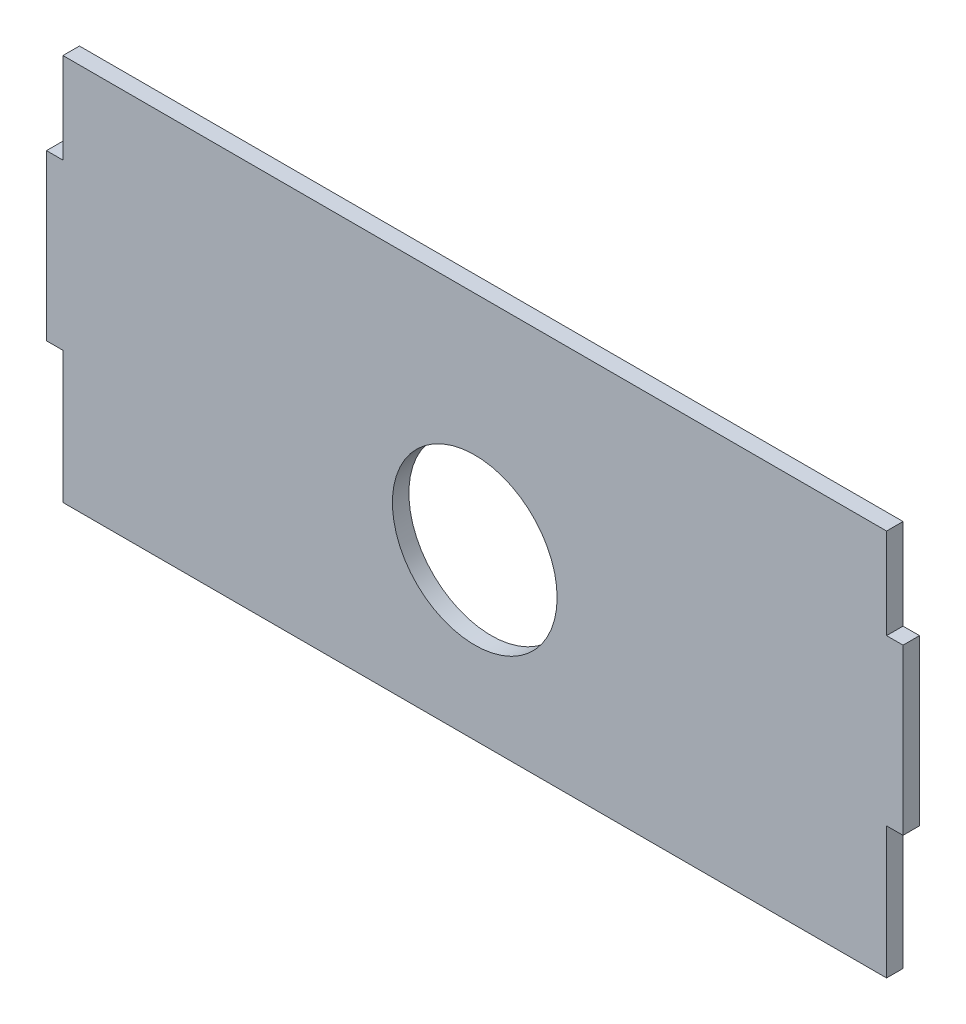
ISO-10303-21;
HEADER;
FILE_DESCRIPTION(('STEP AP214'),'2;1');
FILE_NAME('part.step','',(''),(''),'','','');
FILE_SCHEMA(('AUTOMOTIVE_DESIGN { 1 0 10303 214 1 1 1 1 }'));
ENDSEC;
DATA;
#1=APPLICATION_CONTEXT('core data for automotive mechanical design processes');
#2=APPLICATION_PROTOCOL_DEFINITION('international standard','automotive_design',2000,#1);
#3=PRODUCT_CONTEXT('',#1,'mechanical');
#4=PRODUCT('Part','Part','',(#3));
#5=PRODUCT_RELATED_PRODUCT_CATEGORY('part','',(#4));
#6=PRODUCT_DEFINITION_FORMATION('','',#4);
#7=PRODUCT_DEFINITION_CONTEXT('part definition',#1,'design');
#8=PRODUCT_DEFINITION('design','',#6,#7);
#9=PRODUCT_DEFINITION_SHAPE('','',#8);
#10=(LENGTH_UNIT() NAMED_UNIT(*) SI_UNIT(.MILLI.,.METRE.));
#11=(NAMED_UNIT(*) PLANE_ANGLE_UNIT() SI_UNIT($,.RADIAN.));
#12=(NAMED_UNIT(*) SI_UNIT($,.STERADIAN.) SOLID_ANGLE_UNIT());
#13=UNCERTAINTY_MEASURE_WITH_UNIT(LENGTH_MEASURE(1.E-05),#10,'distance_accuracy_value','');
#14=(GEOMETRIC_REPRESENTATION_CONTEXT(3) GLOBAL_UNCERTAINTY_ASSIGNED_CONTEXT((#13)) GLOBAL_UNIT_ASSIGNED_CONTEXT((#10,
#11,#12)) REPRESENTATION_CONTEXT('',''));
#15=CARTESIAN_POINT('',(0.,0.,0.));
#16=DIRECTION('',(0.,0.,1.));
#17=DIRECTION('',(1.,0.,0.));
#18=AXIS2_PLACEMENT_3D('',#15,#16,#17);
#19=CARTESIAN_POINT('',(50.,20.,2.));
#20=DIRECTION('',(0.,0.,-1.));
#21=DIRECTION('',(-1.,0.,0.));
#22=AXIS2_PLACEMENT_3D('',#19,#20,#21);
#23=CYLINDRICAL_SURFACE('',#22,10.);
#24=CARTESIAN_POINT('',(50.,20.,2.));
#25=DIRECTION('',(0.,0.,1.));
#26=DIRECTION('',(1.,0.,0.));
#27=AXIS2_PLACEMENT_3D('',#24,#25,#26);
#28=CIRCLE('',#27,10.);
#29=CARTESIAN_POINT('',(60.,20.,2.));
#30=VERTEX_POINT('',#29);
#31=EDGE_CURVE('E189',#30,#30,#28,.T.);
#32=ORIENTED_EDGE('',*,*,#31,.T.);
#33=EDGE_LOOP('',(#32));
#34=FACE_BOUND('',#33,.T.);
#35=CARTESIAN_POINT('',(50.,20.,0.));
#36=DIRECTION('',(0.,0.,1.));
#37=DIRECTION('',(1.,0.,0.));
#38=AXIS2_PLACEMENT_3D('',#35,#36,#37);
#39=CIRCLE('',#38,10.);
#40=CARTESIAN_POINT('',(60.,20.,0.));
#41=VERTEX_POINT('',#40);
#42=EDGE_CURVE('E181',#41,#41,#39,.T.);
#43=ORIENTED_EDGE('',*,*,#42,.F.);
#44=EDGE_LOOP('',(#43));
#45=FACE_BOUND('',#44,.T.);
#46=ADVANCED_FACE('F71',(#34,#45),#23,.F.);
#47=CARTESIAN_POINT('',(3.33066907387588E-13,16.0000000000021,2.));
#48=DIRECTION('',(0.,1.,0.));
#49=DIRECTION('',(-1.,0.,0.));
#50=AXIS2_PLACEMENT_3D('',#47,#48,#49);
#51=PLANE('',#50);
#52=DIRECTION('',(1.,0.,0.));
#53=VECTOR('',#52,1.);
#54=CARTESIAN_POINT('',(3.33066907387588E-13,16.0000000000021,0.));
#55=LINE('',#54,#53);
#56=CARTESIAN_POINT('',(100.,16.,0.));
#57=VERTEX_POINT('',#56);
#58=CARTESIAN_POINT('',(102.,16.,0.));
#59=VERTEX_POINT('',#58);
#60=EDGE_CURVE('E178',#57,#59,#55,.T.);
#61=ORIENTED_EDGE('',*,*,#60,.T.);
#62=DIRECTION('',(0.,0.,-1.));
#63=VECTOR('',#62,1.);
#64=CARTESIAN_POINT('',(102.,16.,2.));
#65=LINE('',#64,#63);
#66=CARTESIAN_POINT('',(102.,16.,2.));
#67=VERTEX_POINT('',#66);
#68=EDGE_CURVE('E185',#67,#59,#65,.T.);
#69=ORIENTED_EDGE('',*,*,#68,.F.);
#70=DIRECTION('',(1.,0.,0.));
#71=VECTOR('',#70,1.);
#72=CARTESIAN_POINT('',(3.33066907387588E-13,16.0000000000021,2.));
#73=LINE('',#72,#71);
#74=CARTESIAN_POINT('',(100.,16.,2.));
#75=VERTEX_POINT('',#74);
#76=EDGE_CURVE('E237',#75,#67,#73,.T.);
#77=ORIENTED_EDGE('',*,*,#76,.F.);
#78=DIRECTION('',(0.,0.,-1.));
#79=VECTOR('',#78,1.);
#80=CARTESIAN_POINT('',(100.,16.,2.));
#81=LINE('',#80,#79);
#82=EDGE_CURVE('E188',#75,#57,#81,.T.);
#83=ORIENTED_EDGE('',*,*,#82,.T.);
#84=EDGE_LOOP('',(#61,#69,#77,#83));
#85=FACE_BOUND('',#84,.T.);
#86=ADVANCED_FACE('F234',(#85),#51,.F.);
#87=CARTESIAN_POINT('',(100.,0.,2.));
#88=DIRECTION('',(-1.,0.,0.));
#89=DIRECTION('',(0.,0.,1.));
#90=AXIS2_PLACEMENT_3D('',#87,#88,#89);
#91=PLANE('',#90);
#92=DIRECTION('',(0.,1.,0.));
#93=VECTOR('',#92,1.);
#94=CARTESIAN_POINT('',(100.,0.,0.));
#95=LINE('',#94,#93);
#96=CARTESIAN_POINT('',(100.,0.,0.));
#97=VERTEX_POINT('',#96);
#98=EDGE_CURVE('E177',#97,#57,#95,.T.);
#99=ORIENTED_EDGE('',*,*,#98,.T.);
#100=ORIENTED_EDGE('',*,*,#82,.F.);
#101=DIRECTION('',(0.,1.,0.));
#102=VECTOR('',#101,1.);
#103=CARTESIAN_POINT('',(100.,0.,2.));
#104=LINE('',#103,#102);
#105=CARTESIAN_POINT('',(100.,0.,2.));
#106=VERTEX_POINT('',#105);
#107=EDGE_CURVE('E246',#106,#75,#104,.T.);
#108=ORIENTED_EDGE('',*,*,#107,.F.);
#109=DIRECTION('',(0.,0.,-1.));
#110=VECTOR('',#109,1.);
#111=CARTESIAN_POINT('',(100.,0.,2.));
#112=LINE('',#111,#110);
#113=EDGE_CURVE('E192',#106,#97,#112,.T.);
#114=ORIENTED_EDGE('',*,*,#113,.T.);
#115=EDGE_LOOP('',(#99,#100,#108,#114));
#116=FACE_BOUND('',#115,.T.);
#117=ADVANCED_FACE('F224',(#116),#91,.F.);
#118=CARTESIAN_POINT('',(100.,36.,0.));
#119=VERTEX_POINT('',#118);
#120=CARTESIAN_POINT('',(100.,47.,0.));
#121=VERTEX_POINT('',#120);
#122=EDGE_CURVE('E171',#119,#121,#95,.T.);
#123=ORIENTED_EDGE('',*,*,#122,.T.);
#124=DIRECTION('',(0.,0.,-1.));
#125=VECTOR('',#124,1.);
#126=CARTESIAN_POINT('',(100.,47.,2.));
#127=LINE('',#126,#125);
#128=CARTESIAN_POINT('',(100.,47.,2.));
#129=VERTEX_POINT('',#128);
#130=EDGE_CURVE('E153',#129,#121,#127,.T.);
#131=ORIENTED_EDGE('',*,*,#130,.F.);
#132=CARTESIAN_POINT('',(100.,36.,2.));
#133=VERTEX_POINT('',#132);
#134=EDGE_CURVE('E254',#133,#129,#104,.T.);
#135=ORIENTED_EDGE('',*,*,#134,.F.);
#136=DIRECTION('',(0.,0.,-1.));
#137=VECTOR('',#136,1.);
#138=CARTESIAN_POINT('',(100.,36.,2.));
#139=LINE('',#138,#137);
#140=EDGE_CURVE('E145',#133,#119,#139,.T.);
#141=ORIENTED_EDGE('',*,*,#140,.T.);
#142=EDGE_LOOP('',(#123,#131,#135,#141));
#143=FACE_BOUND('',#142,.T.);
#144=ADVANCED_FACE('F213',(#143),#91,.F.);
#145=CARTESIAN_POINT('',(7.49400541622018E-13,36.0000000000021,2.));
#146=DIRECTION('',(0.,1.,0.));
#147=DIRECTION('',(-1.,0.,0.));
#148=AXIS2_PLACEMENT_3D('',#145,#146,#147);
#149=PLANE('',#148);
#150=DIRECTION('',(1.,0.,0.));
#151=VECTOR('',#150,1.);
#152=CARTESIAN_POINT('',(7.49400541622018E-13,36.0000000000021,0.));
#153=LINE('',#152,#151);
#154=CARTESIAN_POINT('',(102.,36.,0.));
#155=VERTEX_POINT('',#154);
#156=EDGE_CURVE('E216',#119,#155,#153,.T.);
#157=ORIENTED_EDGE('',*,*,#156,.F.);
#158=ORIENTED_EDGE('',*,*,#140,.F.);
#159=DIRECTION('',(1.,0.,0.));
#160=VECTOR('',#159,1.);
#161=CARTESIAN_POINT('',(7.49400541622018E-13,36.0000000000021,2.));
#162=LINE('',#161,#160);
#163=CARTESIAN_POINT('',(102.,36.,2.));
#164=VERTEX_POINT('',#163);
#165=EDGE_CURVE('E257',#133,#164,#162,.T.);
#166=ORIENTED_EDGE('',*,*,#165,.T.);
#167=DIRECTION('',(0.,0.,-1.));
#168=VECTOR('',#167,1.);
#169=CARTESIAN_POINT('',(102.,36.,2.));
#170=LINE('',#169,#168);
#171=EDGE_CURVE('E141',#164,#155,#170,.T.);
#172=ORIENTED_EDGE('',*,*,#171,.T.);
#173=EDGE_LOOP('',(#157,#158,#166,#172));
#174=FACE_BOUND('',#173,.T.);
#175=ADVANCED_FACE('F271',(#174),#149,.T.);
#176=CARTESIAN_POINT('',(102.,0.,2.));
#177=DIRECTION('',(1.,0.,0.));
#178=DIRECTION('',(0.,0.,-1.));
#179=AXIS2_PLACEMENT_3D('',#176,#177,#178);
#180=PLANE('',#179);
#181=DIRECTION('',(0.,-1.,0.));
#182=VECTOR('',#181,1.);
#183=CARTESIAN_POINT('',(102.,0.,0.));
#184=LINE('',#183,#182);
#185=EDGE_CURVE('E217',#155,#59,#184,.T.);
#186=ORIENTED_EDGE('',*,*,#185,.F.);
#187=ORIENTED_EDGE('',*,*,#171,.F.);
#188=DIRECTION('',(0.,-1.,0.));
#189=VECTOR('',#188,1.);
#190=CARTESIAN_POINT('',(102.,0.,2.));
#191=LINE('',#190,#189);
#192=EDGE_CURVE('E184',#164,#67,#191,.T.);
#193=ORIENTED_EDGE('',*,*,#192,.T.);
#194=ORIENTED_EDGE('',*,*,#68,.T.);
#195=EDGE_LOOP('',(#186,#187,#193,#194));
#196=FACE_BOUND('',#195,.T.);
#197=ADVANCED_FACE('F262',(#196),#180,.T.);
#198=CARTESIAN_POINT('',(0.,47.,2.));
#199=DIRECTION('',(0.,1.,0.));
#200=DIRECTION('',(0.,0.,1.));
#201=AXIS2_PLACEMENT_3D('',#198,#199,#200);
#202=PLANE('',#201);
#203=DIRECTION('',(1.,0.,0.));
#204=VECTOR('',#203,1.);
#205=CARTESIAN_POINT('',(0.,47.,0.));
#206=LINE('',#205,#204);
#207=CARTESIAN_POINT('',(0.,47.,0.));
#208=VERTEX_POINT('',#207);
#209=EDGE_CURVE('E168',#208,#121,#206,.T.);
#210=ORIENTED_EDGE('',*,*,#209,.F.);
#211=DIRECTION('',(0.,0.,-1.));
#212=VECTOR('',#211,1.);
#213=CARTESIAN_POINT('',(0.,47.,2.));
#214=LINE('',#213,#212);
#215=CARTESIAN_POINT('',(0.,47.,2.));
#216=VERTEX_POINT('',#215);
#217=EDGE_CURVE('E166',#216,#208,#214,.T.);
#218=ORIENTED_EDGE('',*,*,#217,.F.);
#219=DIRECTION('',(1.,0.,0.));
#220=VECTOR('',#219,1.);
#221=CARTESIAN_POINT('',(0.,47.,2.));
#222=LINE('',#221,#220);
#223=EDGE_CURVE('E207',#216,#129,#222,.T.);
#224=ORIENTED_EDGE('',*,*,#223,.T.);
#225=ORIENTED_EDGE('',*,*,#130,.T.);
#226=EDGE_LOOP('',(#210,#218,#224,#225));
#227=FACE_BOUND('',#226,.T.);
#228=ADVANCED_FACE('F204',(#227),#202,.T.);
#229=CARTESIAN_POINT('',(0.,0.,2.));
#230=DIRECTION('',(0.,1.,0.));
#231=DIRECTION('',(0.,0.,1.));
#232=AXIS2_PLACEMENT_3D('',#229,#230,#231);
#233=PLANE('',#232);
#234=DIRECTION('',(1.,0.,0.));
#235=VECTOR('',#234,1.);
#236=CARTESIAN_POINT('',(0.,0.,0.));
#237=LINE('',#236,#235);
#238=CARTESIAN_POINT('',(0.,0.,0.));
#239=VERTEX_POINT('',#238);
#240=EDGE_CURVE('E170',#239,#97,#237,.T.);
#241=ORIENTED_EDGE('',*,*,#240,.T.);
#242=ORIENTED_EDGE('',*,*,#113,.F.);
#243=DIRECTION('',(1.,0.,0.));
#244=VECTOR('',#243,1.);
#245=CARTESIAN_POINT('',(0.,0.,2.));
#246=LINE('',#245,#244);
#247=CARTESIAN_POINT('',(0.,0.,2.));
#248=VERTEX_POINT('',#247);
#249=EDGE_CURVE('E247',#248,#106,#246,.T.);
#250=ORIENTED_EDGE('',*,*,#249,.F.);
#251=DIRECTION('',(0.,0.,-1.));
#252=VECTOR('',#251,1.);
#253=CARTESIAN_POINT('',(0.,0.,2.));
#254=LINE('',#253,#252);
#255=EDGE_CURVE('E195',#248,#239,#254,.T.);
#256=ORIENTED_EDGE('',*,*,#255,.T.);
#257=EDGE_LOOP('',(#241,#242,#250,#256));
#258=FACE_BOUND('',#257,.T.);
#259=ADVANCED_FACE('F291',(#258),#233,.F.);
#260=CARTESIAN_POINT('',(0.,0.,0.));
#261=DIRECTION('',(0.,0.,1.));
#262=DIRECTION('',(1.,0.,0.));
#263=AXIS2_PLACEMENT_3D('',#260,#261,#262);
#264=PLANE('',#263);
#265=ORIENTED_EDGE('',*,*,#185,.T.);
#266=ORIENTED_EDGE('',*,*,#60,.F.);
#267=ORIENTED_EDGE('',*,*,#98,.F.);
#268=ORIENTED_EDGE('',*,*,#240,.F.);
#269=DIRECTION('',(0.,1.,0.));
#270=VECTOR('',#269,1.);
#271=CARTESIAN_POINT('',(0.,0.,0.));
#272=LINE('',#271,#270);
#273=CARTESIAN_POINT('',(0.,16.,0.));
#274=VERTEX_POINT('',#273);
#275=EDGE_CURVE('E132',#239,#274,#272,.T.);
#276=ORIENTED_EDGE('',*,*,#275,.T.);
#277=DIRECTION('',(-1.,0.,0.));
#278=VECTOR('',#277,1.);
#279=CARTESIAN_POINT('',(0.,16.,0.));
#280=LINE('',#279,#278);
#281=CARTESIAN_POINT('',(-2.,16.,0.));
#282=VERTEX_POINT('',#281);
#283=EDGE_CURVE('E117',#274,#282,#280,.T.);
#284=ORIENTED_EDGE('',*,*,#283,.T.);
#285=DIRECTION('',(0.,-1.,0.));
#286=VECTOR('',#285,1.);
#287=CARTESIAN_POINT('',(-2.,36.,0.));
#288=LINE('',#287,#286);
#289=CARTESIAN_POINT('',(-2.,36.,0.));
#290=VERTEX_POINT('',#289);
#291=EDGE_CURVE('E107',#290,#282,#288,.T.);
#292=ORIENTED_EDGE('',*,*,#291,.F.);
#293=DIRECTION('',(-1.,0.,0.));
#294=VECTOR('',#293,1.);
#295=CARTESIAN_POINT('',(0.,36.,0.));
#296=LINE('',#295,#294);
#297=CARTESIAN_POINT('',(0.,36.,0.));
#298=VERTEX_POINT('',#297);
#299=EDGE_CURVE('E125',#298,#290,#296,.T.);
#300=ORIENTED_EDGE('',*,*,#299,.F.);
#301=EDGE_CURVE('E162',#298,#208,#272,.T.);
#302=ORIENTED_EDGE('',*,*,#301,.T.);
#303=ORIENTED_EDGE('',*,*,#209,.T.);
#304=ORIENTED_EDGE('',*,*,#122,.F.);
#305=ORIENTED_EDGE('',*,*,#156,.T.);
#306=EDGE_LOOP('',(#265,#266,#267,#268,#276,#284,#292,#300,#302,#303,#304,#305));
#307=FACE_BOUND('',#306,.T.);
#308=ORIENTED_EDGE('',*,*,#42,.T.);
#309=EDGE_LOOP('',(#308));
#310=FACE_BOUND('',#309,.T.);
#311=ADVANCED_FACE('F128',(#307,#310),#264,.F.);
#312=CARTESIAN_POINT('',(0.,0.,2.));
#313=DIRECTION('',(0.,0.,1.));
#314=DIRECTION('',(1.,0.,0.));
#315=AXIS2_PLACEMENT_3D('',#312,#313,#314);
#316=PLANE('',#315);
#317=ORIENTED_EDGE('',*,*,#192,.F.);
#318=ORIENTED_EDGE('',*,*,#165,.F.);
#319=ORIENTED_EDGE('',*,*,#134,.T.);
#320=ORIENTED_EDGE('',*,*,#223,.F.);
#321=DIRECTION('',(0.,1.,0.));
#322=VECTOR('',#321,1.);
#323=CARTESIAN_POINT('',(0.,0.,2.));
#324=LINE('',#323,#322);
#325=CARTESIAN_POINT('',(0.,36.,2.));
#326=VERTEX_POINT('',#325);
#327=EDGE_CURVE('E252',#326,#216,#324,.T.);
#328=ORIENTED_EDGE('',*,*,#327,.F.);
#329=DIRECTION('',(-1.,0.,0.));
#330=VECTOR('',#329,1.);
#331=CARTESIAN_POINT('',(0.,36.,2.));
#332=LINE('',#331,#330);
#333=CARTESIAN_POINT('',(-2.,36.,2.));
#334=VERTEX_POINT('',#333);
#335=EDGE_CURVE('E133',#326,#334,#332,.T.);
#336=ORIENTED_EDGE('',*,*,#335,.T.);
#337=DIRECTION('',(0.,-1.,0.));
#338=VECTOR('',#337,1.);
#339=CARTESIAN_POINT('',(-2.,36.,2.));
#340=LINE('',#339,#338);
#341=CARTESIAN_POINT('',(-2.,16.,2.));
#342=VERTEX_POINT('',#341);
#343=EDGE_CURVE('E136',#334,#342,#340,.T.);
#344=ORIENTED_EDGE('',*,*,#343,.T.);
#345=DIRECTION('',(-1.,0.,0.));
#346=VECTOR('',#345,1.);
#347=CARTESIAN_POINT('',(0.,16.,2.));
#348=LINE('',#347,#346);
#349=CARTESIAN_POINT('',(0.,16.,2.));
#350=VERTEX_POINT('',#349);
#351=EDGE_CURVE('E120',#350,#342,#348,.T.);
#352=ORIENTED_EDGE('',*,*,#351,.F.);
#353=EDGE_CURVE('E250',#248,#350,#324,.T.);
#354=ORIENTED_EDGE('',*,*,#353,.F.);
#355=ORIENTED_EDGE('',*,*,#249,.T.);
#356=ORIENTED_EDGE('',*,*,#107,.T.);
#357=ORIENTED_EDGE('',*,*,#76,.T.);
#358=EDGE_LOOP('',(#317,#318,#319,#320,#328,#336,#344,#352,#354,#355,#356,#357));
#359=FACE_BOUND('',#358,.T.);
#360=ORIENTED_EDGE('',*,*,#31,.F.);
#361=EDGE_LOOP('',(#360));
#362=FACE_BOUND('',#361,.T.);
#363=ADVANCED_FACE('F266',(#359,#362),#316,.T.);
#364=CARTESIAN_POINT('',(0.,0.,2.));
#365=DIRECTION('',(-1.,0.,0.));
#366=DIRECTION('',(0.,-1.,0.));
#367=AXIS2_PLACEMENT_3D('',#364,#365,#366);
#368=PLANE('',#367);
#369=ORIENTED_EDGE('',*,*,#353,.T.);
#370=DIRECTION('',(0.,0.,-1.));
#371=VECTOR('',#370,1.);
#372=CARTESIAN_POINT('',(0.,16.,2.));
#373=LINE('',#372,#371);
#374=EDGE_CURVE('E81',#350,#274,#373,.T.);
#375=ORIENTED_EDGE('',*,*,#374,.T.);
#376=ORIENTED_EDGE('',*,*,#275,.F.);
#377=ORIENTED_EDGE('',*,*,#255,.F.);
#378=EDGE_LOOP('',(#369,#375,#376,#377));
#379=FACE_BOUND('',#378,.T.);
#380=ADVANCED_FACE('F293',(#379),#368,.T.);
#381=DIRECTION('',(0.,0.,-1.));
#382=VECTOR('',#381,1.);
#383=CARTESIAN_POINT('',(0.,36.,2.));
#384=LINE('',#383,#382);
#385=EDGE_CURVE('E12',#326,#298,#384,.T.);
#386=ORIENTED_EDGE('',*,*,#385,.F.);
#387=ORIENTED_EDGE('',*,*,#327,.T.);
#388=ORIENTED_EDGE('',*,*,#217,.T.);
#389=ORIENTED_EDGE('',*,*,#301,.F.);
#390=EDGE_LOOP('',(#386,#387,#388,#389));
#391=FACE_BOUND('',#390,.T.);
#392=ADVANCED_FACE('F164',(#391),#368,.T.);
#393=CARTESIAN_POINT('',(-2.,36.,2.));
#394=DIRECTION('',(1.,0.,0.));
#395=DIRECTION('',(0.,1.,0.));
#396=AXIS2_PLACEMENT_3D('',#393,#394,#395);
#397=PLANE('',#396);
#398=ORIENTED_EDGE('',*,*,#291,.T.);
#399=DIRECTION('',(0.,0.,-1.));
#400=VECTOR('',#399,1.);
#401=CARTESIAN_POINT('',(-2.,16.,2.));
#402=LINE('',#401,#400);
#403=EDGE_CURVE('E114',#342,#282,#402,.T.);
#404=ORIENTED_EDGE('',*,*,#403,.F.);
#405=ORIENTED_EDGE('',*,*,#343,.F.);
#406=DIRECTION('',(0.,0.,-1.));
#407=VECTOR('',#406,1.);
#408=CARTESIAN_POINT('',(-2.,36.,2.));
#409=LINE('',#408,#407);
#410=EDGE_CURVE('E75',#334,#290,#409,.T.);
#411=ORIENTED_EDGE('',*,*,#410,.T.);
#412=EDGE_LOOP('',(#398,#404,#405,#411));
#413=FACE_BOUND('',#412,.T.);
#414=ADVANCED_FACE('F122',(#413),#397,.F.);
#415=CARTESIAN_POINT('',(0.,16.,2.));
#416=DIRECTION('',(0.,-1.,0.));
#417=DIRECTION('',(1.,0.,0.));
#418=AXIS2_PLACEMENT_3D('',#415,#416,#417);
#419=PLANE('',#418);
#420=ORIENTED_EDGE('',*,*,#283,.F.);
#421=ORIENTED_EDGE('',*,*,#374,.F.);
#422=ORIENTED_EDGE('',*,*,#351,.T.);
#423=ORIENTED_EDGE('',*,*,#403,.T.);
#424=EDGE_LOOP('',(#420,#421,#422,#423));
#425=FACE_BOUND('',#424,.T.);
#426=ADVANCED_FACE('F115',(#425),#419,.T.);
#427=CARTESIAN_POINT('',(0.,36.,2.));
#428=DIRECTION('',(0.,-1.,0.));
#429=DIRECTION('',(1.,0.,0.));
#430=AXIS2_PLACEMENT_3D('',#427,#428,#429);
#431=PLANE('',#430);
#432=ORIENTED_EDGE('',*,*,#299,.T.);
#433=ORIENTED_EDGE('',*,*,#410,.F.);
#434=ORIENTED_EDGE('',*,*,#335,.F.);
#435=ORIENTED_EDGE('',*,*,#385,.T.);
#436=EDGE_LOOP('',(#432,#433,#434,#435));
#437=FACE_BOUND('',#436,.T.);
#438=ADVANCED_FACE('F73',(#437),#431,.F.);
#439=CLOSED_SHELL('',(#46,#86,#117,#144,#175,#197,#228,#259,#311,#363,#380,#392,#414,#426,#438));
#440=MANIFOLD_SOLID_BREP('B2',#439);
#441=ADVANCED_BREP_SHAPE_REPRESENTATION('',(#18,#440),#14);
#442=SHAPE_DEFINITION_REPRESENTATION(#9,#441);
ENDSEC;
END-ISO-10303-21;
